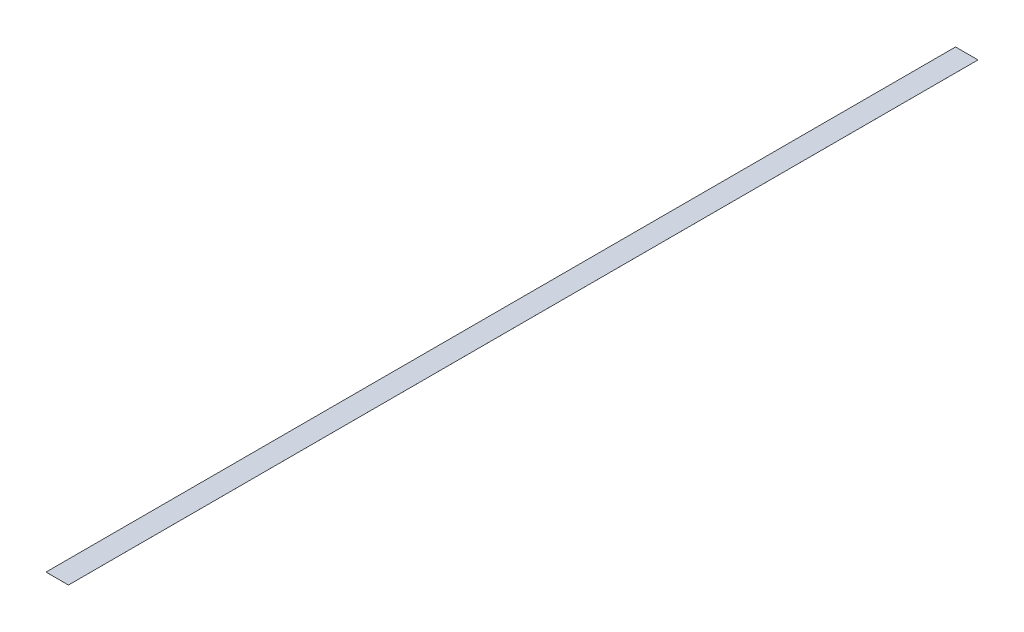
ISO-10303-21;
HEADER;
FILE_DESCRIPTION(('STEP AP214'),'2;1');
FILE_NAME('part.step','',(''),(''),'','','');
FILE_SCHEMA(('AUTOMOTIVE_DESIGN { 1 0 10303 214 1 1 1 1 }'));
ENDSEC;
DATA;
#1=APPLICATION_CONTEXT('core data for automotive mechanical design processes');
#2=APPLICATION_PROTOCOL_DEFINITION('international standard','automotive_design',2000,#1);
#3=PRODUCT_CONTEXT('',#1,'mechanical');
#4=PRODUCT('Part','Part','',(#3));
#5=PRODUCT_RELATED_PRODUCT_CATEGORY('part','',(#4));
#6=PRODUCT_DEFINITION_FORMATION('','',#4);
#7=PRODUCT_DEFINITION_CONTEXT('part definition',#1,'design');
#8=PRODUCT_DEFINITION('design','',#6,#7);
#9=PRODUCT_DEFINITION_SHAPE('','',#8);
#10=(LENGTH_UNIT() NAMED_UNIT(*) SI_UNIT(.MILLI.,.METRE.));
#11=(NAMED_UNIT(*) PLANE_ANGLE_UNIT() SI_UNIT($,.RADIAN.));
#12=(NAMED_UNIT(*) SI_UNIT($,.STERADIAN.) SOLID_ANGLE_UNIT());
#13=UNCERTAINTY_MEASURE_WITH_UNIT(LENGTH_MEASURE(1.E-05),#10,'distance_accuracy_value','');
#14=(GEOMETRIC_REPRESENTATION_CONTEXT(3) GLOBAL_UNCERTAINTY_ASSIGNED_CONTEXT((#13)) GLOBAL_UNIT_ASSIGNED_CONTEXT((#10,
#11,#12)) REPRESENTATION_CONTEXT('',''));
#15=CARTESIAN_POINT('',(0.,0.,0.));
#16=DIRECTION('',(0.,0.,1.));
#17=DIRECTION('',(1.,0.,0.));
#18=AXIS2_PLACEMENT_3D('',#15,#16,#17);
#19=CARTESIAN_POINT('',(526.2664296078,0.01,-269.004496182099));
#20=DIRECTION('',(0.,0.,-1.));
#21=DIRECTION('',(-1.,0.,0.));
#22=AXIS2_PLACEMENT_3D('',#19,#20,#21);
#23=PLANE('',#22);
#24=DIRECTION('',(1.,0.,0.));
#25=VECTOR('',#24,1.);
#26=CARTESIAN_POINT('',(526.2664296078,0.,-269.004496182099));
#27=LINE('',#26,#25);
#28=CARTESIAN_POINT('',(526.2664296078,0.,-269.004496182099));
#29=VERTEX_POINT('',#28);
#30=CARTESIAN_POINT('',(545.200820850489,0.,-269.004496182099));
#31=VERTEX_POINT('',#30);
#32=EDGE_CURVE('E107',#29,#31,#27,.T.);
#33=ORIENTED_EDGE('',*,*,#32,.T.);
#34=DIRECTION('',(0.,-1.,0.));
#35=VECTOR('',#34,1.);
#36=CARTESIAN_POINT('',(545.200820850489,0.01,-269.004496182099));
#37=LINE('',#36,#35);
#38=CARTESIAN_POINT('',(545.200820850489,0.01,-269.004496182099));
#39=VERTEX_POINT('',#38);
#40=EDGE_CURVE('E11',#39,#31,#37,.T.);
#41=ORIENTED_EDGE('',*,*,#40,.F.);
#42=DIRECTION('',(1.,0.,0.));
#43=VECTOR('',#42,1.);
#44=CARTESIAN_POINT('',(526.2664296078,0.01,-269.004496182099));
#45=LINE('',#44,#43);
#46=CARTESIAN_POINT('',(526.2664296078,0.01,-269.004496182099));
#47=VERTEX_POINT('',#46);
#48=EDGE_CURVE('E89',#47,#39,#45,.T.);
#49=ORIENTED_EDGE('',*,*,#48,.F.);
#50=DIRECTION('',(0.,-1.,0.));
#51=VECTOR('',#50,1.);
#52=CARTESIAN_POINT('',(526.2664296078,0.01,-269.004496182099));
#53=LINE('',#52,#51);
#54=EDGE_CURVE('E56',#47,#29,#53,.T.);
#55=ORIENTED_EDGE('',*,*,#54,.T.);
#56=EDGE_LOOP('',(#33,#41,#49,#55));
#57=FACE_BOUND('',#56,.T.);
#58=ADVANCED_FACE('F39',(#57),#23,.F.);
#59=CARTESIAN_POINT('',(545.200820850489,0.01,-269.004496182099));
#60=DIRECTION('',(-1.,0.,0.));
#61=DIRECTION('',(0.,0.,1.));
#62=AXIS2_PLACEMENT_3D('',#59,#60,#61);
#63=PLANE('',#62);
#64=DIRECTION('',(0.,0.,-1.));
#65=VECTOR('',#64,1.);
#66=CARTESIAN_POINT('',(545.200820850489,0.,-269.004496182099));
#67=LINE('',#66,#65);
#68=CARTESIAN_POINT('',(545.200820850489,0.,-1035.87068627363));
#69=VERTEX_POINT('',#68);
#70=EDGE_CURVE('E95',#31,#69,#67,.T.);
#71=ORIENTED_EDGE('',*,*,#70,.T.);
#72=DIRECTION('',(0.,-1.,0.));
#73=VECTOR('',#72,1.);
#74=CARTESIAN_POINT('',(545.200820850489,0.01,-1035.87068627363));
#75=LINE('',#74,#73);
#76=CARTESIAN_POINT('',(545.200820850489,0.01,-1035.87068627363));
#77=VERTEX_POINT('',#76);
#78=EDGE_CURVE('E48',#77,#69,#75,.T.);
#79=ORIENTED_EDGE('',*,*,#78,.F.);
#80=DIRECTION('',(0.,0.,-1.));
#81=VECTOR('',#80,1.);
#82=CARTESIAN_POINT('',(545.200820850489,0.01,-269.004496182099));
#83=LINE('',#82,#81);
#84=EDGE_CURVE('E81',#39,#77,#83,.T.);
#85=ORIENTED_EDGE('',*,*,#84,.F.);
#86=ORIENTED_EDGE('',*,*,#40,.T.);
#87=EDGE_LOOP('',(#71,#79,#85,#86));
#88=FACE_BOUND('',#87,.T.);
#89=ADVANCED_FACE('F94',(#88),#63,.F.);
#90=CARTESIAN_POINT('',(526.2664296078,0.01,-1035.87068627363));
#91=DIRECTION('',(0.,0.,-1.));
#92=DIRECTION('',(-1.,0.,0.));
#93=AXIS2_PLACEMENT_3D('',#90,#91,#92);
#94=PLANE('',#93);
#95=DIRECTION('',(1.,0.,0.));
#96=VECTOR('',#95,1.);
#97=CARTESIAN_POINT('',(526.2664296078,0.,-1035.87068627363));
#98=LINE('',#97,#96);
#99=CARTESIAN_POINT('',(526.2664296078,0.,-1035.87068627363));
#100=VERTEX_POINT('',#99);
#101=EDGE_CURVE('E112',#100,#69,#98,.T.);
#102=ORIENTED_EDGE('',*,*,#101,.F.);
#103=DIRECTION('',(0.,-1.,0.));
#104=VECTOR('',#103,1.);
#105=CARTESIAN_POINT('',(526.2664296078,0.01,-1035.87068627363));
#106=LINE('',#105,#104);
#107=CARTESIAN_POINT('',(526.2664296078,0.01,-1035.87068627363));
#108=VERTEX_POINT('',#107);
#109=EDGE_CURVE('E70',#108,#100,#106,.T.);
#110=ORIENTED_EDGE('',*,*,#109,.F.);
#111=DIRECTION('',(1.,0.,0.));
#112=VECTOR('',#111,1.);
#113=CARTESIAN_POINT('',(526.2664296078,0.01,-1035.87068627363));
#114=LINE('',#113,#112);
#115=EDGE_CURVE('E88',#108,#77,#114,.T.);
#116=ORIENTED_EDGE('',*,*,#115,.T.);
#117=ORIENTED_EDGE('',*,*,#78,.T.);
#118=EDGE_LOOP('',(#102,#110,#116,#117));
#119=FACE_BOUND('',#118,.T.);
#120=ADVANCED_FACE('F99',(#119),#94,.T.);
#121=CARTESIAN_POINT('',(526.2664296078,0.01,-269.004496182099));
#122=DIRECTION('',(-1.,0.,0.));
#123=DIRECTION('',(0.,0.,1.));
#124=AXIS2_PLACEMENT_3D('',#121,#122,#123);
#125=PLANE('',#124);
#126=DIRECTION('',(0.,0.,-1.));
#127=VECTOR('',#126,1.);
#128=CARTESIAN_POINT('',(526.2664296078,0.,-269.004496182099));
#129=LINE('',#128,#127);
#130=EDGE_CURVE('E115',#29,#100,#129,.T.);
#131=ORIENTED_EDGE('',*,*,#130,.F.);
#132=ORIENTED_EDGE('',*,*,#54,.F.);
#133=DIRECTION('',(0.,0.,-1.));
#134=VECTOR('',#133,1.);
#135=CARTESIAN_POINT('',(526.2664296078,0.01,-269.004496182099));
#136=LINE('',#135,#134);
#137=EDGE_CURVE('E101',#47,#108,#136,.T.);
#138=ORIENTED_EDGE('',*,*,#137,.T.);
#139=ORIENTED_EDGE('',*,*,#109,.T.);
#140=EDGE_LOOP('',(#131,#132,#138,#139));
#141=FACE_BOUND('',#140,.T.);
#142=ADVANCED_FACE('F125',(#141),#125,.T.);
#143=CARTESIAN_POINT('',(0.,0.01,0.));
#144=DIRECTION('',(0.,1.,0.));
#145=DIRECTION('',(0.,0.,1.));
#146=AXIS2_PLACEMENT_3D('',#143,#144,#145);
#147=PLANE('',#146);
#148=ORIENTED_EDGE('',*,*,#48,.T.);
#149=ORIENTED_EDGE('',*,*,#84,.T.);
#150=ORIENTED_EDGE('',*,*,#115,.F.);
#151=ORIENTED_EDGE('',*,*,#137,.F.);
#152=EDGE_LOOP('',(#148,#149,#150,#151));
#153=FACE_BOUND('',#152,.T.);
#154=ADVANCED_FACE('F85',(#153),#147,.T.);
#155=CARTESIAN_POINT('',(0.,0.,0.));
#156=DIRECTION('',(0.,1.,0.));
#157=DIRECTION('',(0.,0.,1.));
#158=AXIS2_PLACEMENT_3D('',#155,#156,#157);
#159=PLANE('',#158);
#160=ORIENTED_EDGE('',*,*,#32,.F.);
#161=ORIENTED_EDGE('',*,*,#130,.T.);
#162=ORIENTED_EDGE('',*,*,#101,.T.);
#163=ORIENTED_EDGE('',*,*,#70,.F.);
#164=EDGE_LOOP('',(#160,#161,#162,#163));
#165=FACE_BOUND('',#164,.T.);
#166=ADVANCED_FACE('F124',(#165),#159,.F.);
#167=CLOSED_SHELL('',(#58,#89,#120,#142,#154,#166));
#168=MANIFOLD_SOLID_BREP('B2',#167);
#169=ADVANCED_BREP_SHAPE_REPRESENTATION('',(#18,#168),#14);
#170=SHAPE_DEFINITION_REPRESENTATION(#9,#169);
ENDSEC;
END-ISO-10303-21;
